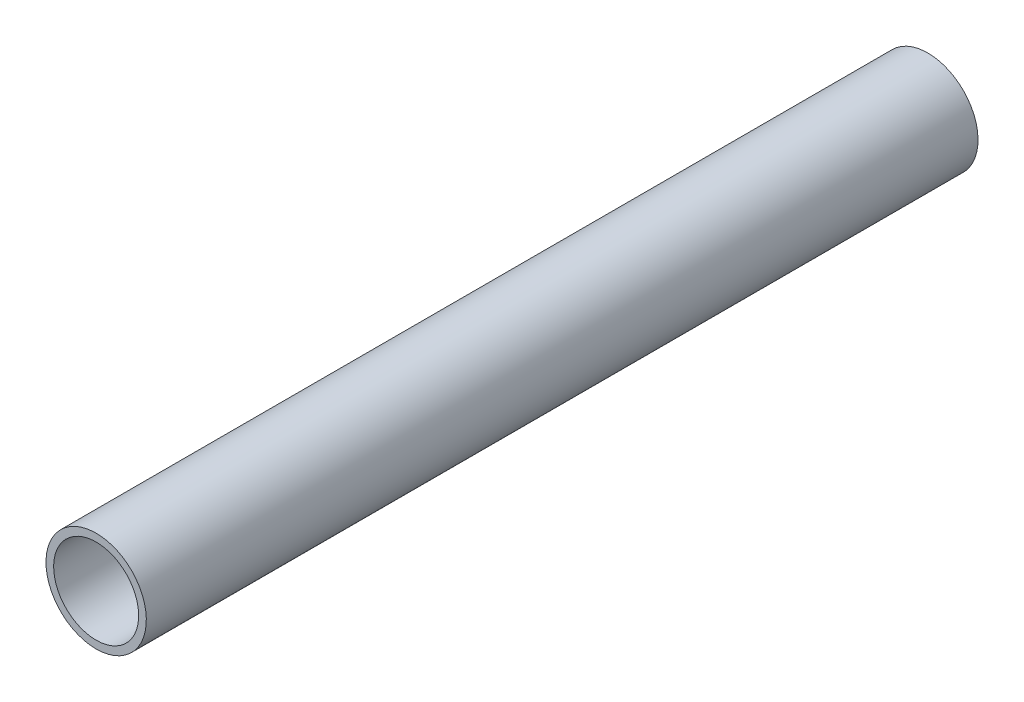
ISO-10303-21;
HEADER;
FILE_DESCRIPTION(('STEP AP214'),'2;1');
FILE_NAME('part.step','',(''),(''),'','','');
FILE_SCHEMA(('AUTOMOTIVE_DESIGN { 1 0 10303 214 1 1 1 1 }'));
ENDSEC;
DATA;
#1=APPLICATION_CONTEXT('core data for automotive mechanical design processes');
#2=APPLICATION_PROTOCOL_DEFINITION('international standard','automotive_design',2000,#1);
#3=PRODUCT_CONTEXT('',#1,'mechanical');
#4=PRODUCT('Part','Part','',(#3));
#5=PRODUCT_RELATED_PRODUCT_CATEGORY('part','',(#4));
#6=PRODUCT_DEFINITION_FORMATION('','',#4);
#7=PRODUCT_DEFINITION_CONTEXT('part definition',#1,'design');
#8=PRODUCT_DEFINITION('design','',#6,#7);
#9=PRODUCT_DEFINITION_SHAPE('','',#8);
#10=(LENGTH_UNIT() NAMED_UNIT(*) SI_UNIT(.MILLI.,.METRE.));
#11=(NAMED_UNIT(*) PLANE_ANGLE_UNIT() SI_UNIT($,.RADIAN.));
#12=(NAMED_UNIT(*) SI_UNIT($,.STERADIAN.) SOLID_ANGLE_UNIT());
#13=UNCERTAINTY_MEASURE_WITH_UNIT(LENGTH_MEASURE(1.E-05),#10,'distance_accuracy_value','');
#14=(GEOMETRIC_REPRESENTATION_CONTEXT(3) GLOBAL_UNCERTAINTY_ASSIGNED_CONTEXT((#13)) GLOBAL_UNIT_ASSIGNED_CONTEXT((#10,
#11,#12)) REPRESENTATION_CONTEXT('',''));
#15=CARTESIAN_POINT('',(0.,0.,0.));
#16=DIRECTION('',(0.,0.,1.));
#17=DIRECTION('',(1.,0.,0.));
#18=AXIS2_PLACEMENT_3D('',#15,#16,#17);
#19=CARTESIAN_POINT('',(0.,0.,200.));
#20=DIRECTION('',(0.,0.,1.));
#21=DIRECTION('',(0.,-1.,0.));
#22=AXIS2_PLACEMENT_3D('',#19,#20,#21);
#23=CYLINDRICAL_SURFACE('',#22,24.13);
#24=CARTESIAN_POINT('',(0.,0.,200.));
#25=DIRECTION('',(0.,0.,1.));
#26=DIRECTION('',(0.,-1.,0.));
#27=AXIS2_PLACEMENT_3D('',#24,#25,#26);
#28=CIRCLE('',#27,24.13);
#29=CARTESIAN_POINT('',(0.,-24.13,200.));
#30=VERTEX_POINT('',#29);
#31=EDGE_CURVE('E55',#30,#30,#28,.T.);
#32=ORIENTED_EDGE('',*,*,#31,.F.);
#33=EDGE_LOOP('',(#32));
#34=FACE_BOUND('',#33,.T.);
#35=CARTESIAN_POINT('',(0.,0.,-200.));
#36=DIRECTION('',(0.,0.,1.));
#37=DIRECTION('',(0.,-1.,0.));
#38=AXIS2_PLACEMENT_3D('',#35,#36,#37);
#39=CIRCLE('',#38,24.13);
#40=CARTESIAN_POINT('',(0.,-24.1299999999999,-200.));
#41=VERTEX_POINT('',#40);
#42=EDGE_CURVE('E10',#41,#41,#39,.T.);
#43=ORIENTED_EDGE('',*,*,#42,.T.);
#44=EDGE_LOOP('',(#43));
#45=FACE_BOUND('',#44,.T.);
#46=ADVANCED_FACE('F41',(#34,#45),#23,.T.);
#47=CARTESIAN_POINT('',(0.,24.1300000000001,-200.));
#48=DIRECTION('',(0.,0.,1.));
#49=DIRECTION('',(0.,-1.,0.));
#50=AXIS2_PLACEMENT_3D('',#47,#48,#49);
#51=PLANE('',#50);
#52=ORIENTED_EDGE('',*,*,#42,.F.);
#53=EDGE_LOOP('',(#52));
#54=FACE_BOUND('',#53,.T.);
#55=CARTESIAN_POINT('',(0.,0.,-200.));
#56=DIRECTION('',(0.,0.,1.));
#57=DIRECTION('',(0.,-1.,0.));
#58=AXIS2_PLACEMENT_3D('',#55,#56,#57);
#59=CIRCLE('',#58,20.447);
#60=CARTESIAN_POINT('',(0.,-20.4469999999999,-200.));
#61=VERTEX_POINT('',#60);
#62=EDGE_CURVE('E47',#61,#61,#59,.T.);
#63=ORIENTED_EDGE('',*,*,#62,.T.);
#64=EDGE_LOOP('',(#63));
#65=FACE_BOUND('',#64,.T.);
#66=ADVANCED_FACE('F64',(#54,#65),#51,.F.);
#67=CARTESIAN_POINT('',(0.,0.,200.));
#68=DIRECTION('',(0.,0.,1.));
#69=DIRECTION('',(0.,-1.,0.));
#70=AXIS2_PLACEMENT_3D('',#67,#68,#69);
#71=CYLINDRICAL_SURFACE('',#70,20.447);
#72=ORIENTED_EDGE('',*,*,#62,.F.);
#73=EDGE_LOOP('',(#72));
#74=FACE_BOUND('',#73,.T.);
#75=CARTESIAN_POINT('',(0.,0.,200.));
#76=DIRECTION('',(0.,0.,1.));
#77=DIRECTION('',(0.,-1.,0.));
#78=AXIS2_PLACEMENT_3D('',#75,#76,#77);
#79=CIRCLE('',#78,20.447);
#80=CARTESIAN_POINT('',(0.,-20.447,200.));
#81=VERTEX_POINT('',#80);
#82=EDGE_CURVE('E51',#81,#81,#79,.T.);
#83=ORIENTED_EDGE('',*,*,#82,.T.);
#84=EDGE_LOOP('',(#83));
#85=FACE_BOUND('',#84,.T.);
#86=ADVANCED_FACE('F68',(#74,#85),#71,.F.);
#87=CARTESIAN_POINT('',(0.,24.13,200.));
#88=DIRECTION('',(0.,0.,-1.));
#89=DIRECTION('',(0.,1.,0.));
#90=AXIS2_PLACEMENT_3D('',#87,#88,#89);
#91=PLANE('',#90);
#92=ORIENTED_EDGE('',*,*,#82,.F.);
#93=EDGE_LOOP('',(#92));
#94=FACE_BOUND('',#93,.T.);
#95=ORIENTED_EDGE('',*,*,#31,.T.);
#96=EDGE_LOOP('',(#95));
#97=FACE_BOUND('',#96,.T.);
#98=ADVANCED_FACE('F61',(#94,#97),#91,.F.);
#99=CLOSED_SHELL('',(#46,#66,#86,#98));
#100=MANIFOLD_SOLID_BREP('B2',#99);
#101=ADVANCED_BREP_SHAPE_REPRESENTATION('',(#18,#100),#14);
#102=SHAPE_DEFINITION_REPRESENTATION(#9,#101);
ENDSEC;
END-ISO-10303-21;
